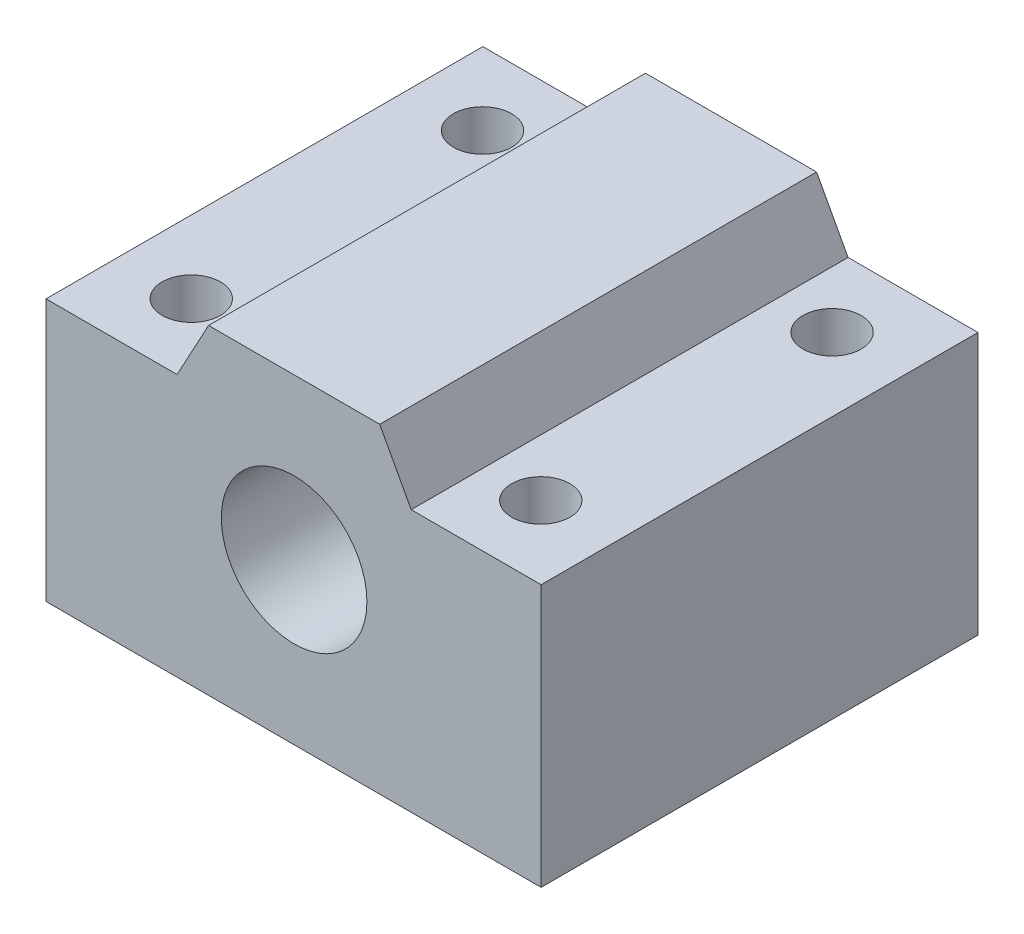
ISO-10303-21;
HEADER;
FILE_DESCRIPTION(('STEP AP214'),'2;1');
FILE_NAME('part.step','',(''),(''),'','','');
FILE_SCHEMA(('AUTOMOTIVE_DESIGN { 1 0 10303 214 1 1 1 1 }'));
ENDSEC;
DATA;
#1=APPLICATION_CONTEXT('core data for automotive mechanical design processes');
#2=APPLICATION_PROTOCOL_DEFINITION('international standard','automotive_design',2000,#1);
#3=PRODUCT_CONTEXT('',#1,'mechanical');
#4=PRODUCT('Part','Part','',(#3));
#5=PRODUCT_RELATED_PRODUCT_CATEGORY('part','',(#4));
#6=PRODUCT_DEFINITION_FORMATION('','',#4);
#7=PRODUCT_DEFINITION_CONTEXT('part definition',#1,'design');
#8=PRODUCT_DEFINITION('design','',#6,#7);
#9=PRODUCT_DEFINITION_SHAPE('','',#8);
#10=(LENGTH_UNIT() NAMED_UNIT(*) SI_UNIT(.MILLI.,.METRE.));
#11=(NAMED_UNIT(*) PLANE_ANGLE_UNIT() SI_UNIT($,.RADIAN.));
#12=(NAMED_UNIT(*) SI_UNIT($,.STERADIAN.) SOLID_ANGLE_UNIT());
#13=UNCERTAINTY_MEASURE_WITH_UNIT(LENGTH_MEASURE(1.E-05),#10,'distance_accuracy_value','');
#14=(GEOMETRIC_REPRESENTATION_CONTEXT(3) GLOBAL_UNCERTAINTY_ASSIGNED_CONTEXT((#13)) GLOBAL_UNIT_ASSIGNED_CONTEXT((#10,
#11,#12)) REPRESENTATION_CONTEXT('',''));
#15=CARTESIAN_POINT('',(0.,0.,0.));
#16=DIRECTION('',(0.,0.,1.));
#17=DIRECTION('',(1.,0.,0.));
#18=AXIS2_PLACEMENT_3D('',#15,#16,#17);
#19=CARTESIAN_POINT('',(-17.038514805397,7.00050951673756,-30.));
#20=DIRECTION('',(-1.,0.,0.));
#21=DIRECTION('',(0.,0.,1.));
#22=AXIS2_PLACEMENT_3D('',#19,#20,#21);
#23=PLANE('',#22);
#24=DIRECTION('',(0.,-1.,0.));
#25=VECTOR('',#24,1.);
#26=CARTESIAN_POINT('',(-17.038514805397,7.00050951673756,0.));
#27=LINE('',#26,#25);
#28=CARTESIAN_POINT('',(-17.038514805397,7.00050951673756,0.));
#29=VERTEX_POINT('',#28);
#30=CARTESIAN_POINT('',(-17.038514805397,-10.9994470782104,0.));
#31=VERTEX_POINT('',#30);
#32=EDGE_CURVE('E142',#29,#31,#27,.T.);
#33=ORIENTED_EDGE('',*,*,#32,.F.);
#34=DIRECTION('',(0.,0.,1.));
#35=VECTOR('',#34,1.);
#36=CARTESIAN_POINT('',(-17.038514805397,7.00050951673756,-30.));
#37=LINE('',#36,#35);
#38=CARTESIAN_POINT('',(-17.038514805397,7.00050951673756,-30.));
#39=VERTEX_POINT('',#38);
#40=EDGE_CURVE('E13',#39,#29,#37,.T.);
#41=ORIENTED_EDGE('',*,*,#40,.F.);
#42=DIRECTION('',(0.,-1.,0.));
#43=VECTOR('',#42,1.);
#44=CARTESIAN_POINT('',(-17.038514805397,7.00050951673756,-30.));
#45=LINE('',#44,#43);
#46=CARTESIAN_POINT('',(-17.038514805397,-10.9994470782104,-30.));
#47=VERTEX_POINT('',#46);
#48=EDGE_CURVE('E163',#39,#47,#45,.T.);
#49=ORIENTED_EDGE('',*,*,#48,.T.);
#50=DIRECTION('',(0.,0.,1.));
#51=VECTOR('',#50,1.);
#52=CARTESIAN_POINT('',(-17.038514805397,-10.9994470782104,-30.));
#53=LINE('',#52,#51);
#54=EDGE_CURVE('E100',#47,#31,#53,.T.);
#55=ORIENTED_EDGE('',*,*,#54,.T.);
#56=EDGE_LOOP('',(#33,#41,#49,#55));
#57=FACE_BOUND('',#56,.T.);
#58=ADVANCED_FACE('F44',(#57),#23,.T.);
#59=CARTESIAN_POINT('',(-17.038514805397,7.00050951673756,-30.));
#60=DIRECTION('',(0.,1.,0.));
#61=DIRECTION('',(0.,0.,1.));
#62=AXIS2_PLACEMENT_3D('',#59,#60,#61);
#63=PLANE('',#62);
#64=CARTESIAN_POINT('',(-12.0619027918226,7.00050951673755,-24.9999863250474));
#65=DIRECTION('',(0.,1.,0.));
#66=DIRECTION('',(0.,0.,1.));
#67=AXIS2_PLACEMENT_3D('',#64,#65,#66);
#68=CIRCLE('',#67,2.);
#69=CARTESIAN_POINT('',(-12.0619027918226,7.00050951673755,-22.9999863250474));
#70=VERTEX_POINT('',#69);
#71=EDGE_CURVE('E178',#70,#70,#68,.T.);
#72=ORIENTED_EDGE('',*,*,#71,.F.);
#73=EDGE_LOOP('',(#72));
#74=FACE_BOUND('',#73,.T.);
#75=CARTESIAN_POINT('',(-12.0619027918226,7.00050951673755,-5.));
#76=DIRECTION('',(0.,1.,0.));
#77=DIRECTION('',(0.,0.,1.));
#78=AXIS2_PLACEMENT_3D('',#75,#76,#77);
#79=CIRCLE('',#78,2.);
#80=CARTESIAN_POINT('',(-12.0619027918226,7.00050951673755,-3.));
#81=VERTEX_POINT('',#80);
#82=EDGE_CURVE('E177',#81,#81,#79,.T.);
#83=ORIENTED_EDGE('',*,*,#82,.F.);
#84=EDGE_LOOP('',(#83));
#85=FACE_BOUND('',#84,.T.);
#86=DIRECTION('',(-1.,0.,0.));
#87=VECTOR('',#86,1.);
#88=CARTESIAN_POINT('',(-17.038514805397,7.00050951673756,0.));
#89=LINE('',#88,#87);
#90=CARTESIAN_POINT('',(-8.03851480550169,7.00050951673756,0.));
#91=VERTEX_POINT('',#90);
#92=EDGE_CURVE('E161',#91,#29,#89,.T.);
#93=ORIENTED_EDGE('',*,*,#92,.F.);
#94=DIRECTION('',(0.,0.,1.));
#95=VECTOR('',#94,1.);
#96=CARTESIAN_POINT('',(-8.03851480550169,7.00050951673756,-30.));
#97=LINE('',#96,#95);
#98=CARTESIAN_POINT('',(-8.03851480550169,7.00050951673756,-30.));
#99=VERTEX_POINT('',#98);
#100=EDGE_CURVE('E53',#99,#91,#97,.T.);
#101=ORIENTED_EDGE('',*,*,#100,.F.);
#102=DIRECTION('',(-1.,0.,0.));
#103=VECTOR('',#102,1.);
#104=CARTESIAN_POINT('',(-17.038514805397,7.00050951673756,-30.));
#105=LINE('',#104,#103);
#106=EDGE_CURVE('E132',#99,#39,#105,.T.);
#107=ORIENTED_EDGE('',*,*,#106,.T.);
#108=ORIENTED_EDGE('',*,*,#40,.T.);
#109=EDGE_LOOP('',(#93,#101,#107,#108));
#110=FACE_BOUND('',#109,.T.);
#111=ADVANCED_FACE('F222',(#74,#85,#110),#63,.T.);
#112=CARTESIAN_POINT('',(-8.03851480550169,7.00050951673756,-30.));
#113=DIRECTION('',(-0.879636229350889,0.475647037217042,0.));
#114=DIRECTION('',(-0.475647037217042,-0.879636229350889,0.));
#115=AXIS2_PLACEMENT_3D('',#112,#113,#114);
#116=PLANE('',#115);
#117=DIRECTION('',(-0.475647037217042,-0.879636229350889,0.));
#118=VECTOR('',#117,1.);
#119=CARTESIAN_POINT('',(-8.03851480550169,7.00050951673756,0.));
#120=LINE('',#119,#118);
#121=CARTESIAN_POINT('',(-5.87556524650438,11.0005529217896,0.));
#122=VERTEX_POINT('',#121);
#123=EDGE_CURVE('E119',#122,#91,#120,.T.);
#124=ORIENTED_EDGE('',*,*,#123,.F.);
#125=DIRECTION('',(0.,0.,1.));
#126=VECTOR('',#125,1.);
#127=CARTESIAN_POINT('',(-5.87556524650438,11.0005529217896,-30.));
#128=LINE('',#127,#126);
#129=CARTESIAN_POINT('',(-5.87556524650438,11.0005529217896,-30.));
#130=VERTEX_POINT('',#129);
#131=EDGE_CURVE('E114',#130,#122,#128,.T.);
#132=ORIENTED_EDGE('',*,*,#131,.F.);
#133=DIRECTION('',(-0.475647037217042,-0.879636229350889,0.));
#134=VECTOR('',#133,1.);
#135=CARTESIAN_POINT('',(-8.03851480550169,7.00050951673756,-30.));
#136=LINE('',#135,#134);
#137=EDGE_CURVE('E117',#130,#99,#136,.T.);
#138=ORIENTED_EDGE('',*,*,#137,.T.);
#139=ORIENTED_EDGE('',*,*,#100,.T.);
#140=EDGE_LOOP('',(#124,#132,#138,#139));
#141=FACE_BOUND('',#140,.T.);
#142=ADVANCED_FACE('F116',(#141),#116,.T.);
#143=CARTESIAN_POINT('',(-5.87556524650438,11.0005529217896,-30.));
#144=DIRECTION('',(0.,1.,0.));
#145=DIRECTION('',(0.,0.,1.));
#146=AXIS2_PLACEMENT_3D('',#143,#144,#145);
#147=PLANE('',#146);
#148=DIRECTION('',(-1.,0.,0.));
#149=VECTOR('',#148,1.);
#150=CARTESIAN_POINT('',(-5.87556524650438,11.0005529217896,0.));
#151=LINE('',#150,#149);
#152=CARTESIAN_POINT('',(5.87759460077598,11.0005529217896,0.));
#153=VERTEX_POINT('',#152);
#154=EDGE_CURVE('E158',#153,#122,#151,.T.);
#155=ORIENTED_EDGE('',*,*,#154,.F.);
#156=DIRECTION('',(0.,0.,1.));
#157=VECTOR('',#156,1.);
#158=CARTESIAN_POINT('',(5.87759460077598,11.0005529217896,-30.));
#159=LINE('',#158,#157);
#160=CARTESIAN_POINT('',(5.87759460077598,11.0005529217896,-30.));
#161=VERTEX_POINT('',#160);
#162=EDGE_CURVE('E124',#161,#153,#159,.T.);
#163=ORIENTED_EDGE('',*,*,#162,.F.);
#164=DIRECTION('',(-1.,0.,0.));
#165=VECTOR('',#164,1.);
#166=CARTESIAN_POINT('',(-5.87556524650438,11.0005529217896,-30.));
#167=LINE('',#166,#165);
#168=EDGE_CURVE('E130',#161,#130,#167,.T.);
#169=ORIENTED_EDGE('',*,*,#168,.T.);
#170=ORIENTED_EDGE('',*,*,#131,.T.);
#171=EDGE_LOOP('',(#155,#163,#169,#170));
#172=FACE_BOUND('',#171,.T.);
#173=ADVANCED_FACE('F134',(#172),#147,.T.);
#174=CARTESIAN_POINT('',(5.87759460077598,11.0005529217896,-30.));
#175=DIRECTION('',(0.879636229350889,0.475647037217042,0.));
#176=DIRECTION('',(-0.475647037217042,0.879636229350889,0.));
#177=AXIS2_PLACEMENT_3D('',#174,#175,#176);
#178=PLANE('',#177);
#179=DIRECTION('',(-0.475647037217042,0.879636229350889,0.));
#180=VECTOR('',#179,1.);
#181=CARTESIAN_POINT('',(5.87759460077598,11.0005529217896,0.));
#182=LINE('',#181,#180);
#183=CARTESIAN_POINT('',(8.0405441597733,7.00050951673756,0.));
#184=VERTEX_POINT('',#183);
#185=EDGE_CURVE('E155',#184,#153,#182,.T.);
#186=ORIENTED_EDGE('',*,*,#185,.F.);
#187=DIRECTION('',(0.,0.,1.));
#188=VECTOR('',#187,1.);
#189=CARTESIAN_POINT('',(8.0405441597733,7.00050951673756,-30.));
#190=LINE('',#189,#188);
#191=CARTESIAN_POINT('',(8.0405441597733,7.00050951673756,-30.));
#192=VERTEX_POINT('',#191);
#193=EDGE_CURVE('E167',#192,#184,#190,.T.);
#194=ORIENTED_EDGE('',*,*,#193,.F.);
#195=DIRECTION('',(-0.475647037217042,0.879636229350889,0.));
#196=VECTOR('',#195,1.);
#197=CARTESIAN_POINT('',(5.87759460077598,11.0005529217896,-30.));
#198=LINE('',#197,#196);
#199=EDGE_CURVE('E135',#192,#161,#198,.T.);
#200=ORIENTED_EDGE('',*,*,#199,.T.);
#201=ORIENTED_EDGE('',*,*,#162,.T.);
#202=EDGE_LOOP('',(#186,#194,#200,#201));
#203=FACE_BOUND('',#202,.T.);
#204=ADVANCED_FACE('F238',(#203),#178,.T.);
#205=CARTESIAN_POINT('',(8.0405441597733,7.00050951673756,-30.));
#206=DIRECTION('',(0.,1.,0.));
#207=DIRECTION('',(0.,0.,1.));
#208=AXIS2_PLACEMENT_3D('',#205,#206,#207);
#209=PLANE('',#208);
#210=CARTESIAN_POINT('',(11.9380972081735,7.00050951673755,-5.));
#211=DIRECTION('',(0.,1.,0.));
#212=DIRECTION('',(0.,0.,1.));
#213=AXIS2_PLACEMENT_3D('',#210,#211,#212);
#214=CIRCLE('',#213,2.);
#215=CARTESIAN_POINT('',(11.9380972081735,7.00050951673755,-3.));
#216=VERTEX_POINT('',#215);
#217=EDGE_CURVE('E184',#216,#216,#214,.T.);
#218=ORIENTED_EDGE('',*,*,#217,.F.);
#219=EDGE_LOOP('',(#218));
#220=FACE_BOUND('',#219,.T.);
#221=CARTESIAN_POINT('',(11.9380972081735,7.00050951673755,-24.9999863250474));
#222=DIRECTION('',(0.,1.,0.));
#223=DIRECTION('',(0.,0.,1.));
#224=AXIS2_PLACEMENT_3D('',#221,#222,#223);
#225=CIRCLE('',#224,2.);
#226=CARTESIAN_POINT('',(11.9380972081735,7.00050951673755,-22.9999863250474));
#227=VERTEX_POINT('',#226);
#228=EDGE_CURVE('E181',#227,#227,#225,.T.);
#229=ORIENTED_EDGE('',*,*,#228,.F.);
#230=EDGE_LOOP('',(#229));
#231=FACE_BOUND('',#230,.T.);
#232=DIRECTION('',(-1.,0.,0.));
#233=VECTOR('',#232,1.);
#234=CARTESIAN_POINT('',(8.0405441597733,7.00050951673756,0.));
#235=LINE('',#234,#233);
#236=CARTESIAN_POINT('',(16.961485194603,7.00050951673756,0.));
#237=VERTEX_POINT('',#236);
#238=EDGE_CURVE('E152',#237,#184,#235,.T.);
#239=ORIENTED_EDGE('',*,*,#238,.F.);
#240=DIRECTION('',(0.,0.,1.));
#241=VECTOR('',#240,1.);
#242=CARTESIAN_POINT('',(16.961485194603,7.00050951673756,-30.));
#243=LINE('',#242,#241);
#244=CARTESIAN_POINT('',(16.961485194603,7.00050951673756,-30.));
#245=VERTEX_POINT('',#244);
#246=EDGE_CURVE('E169',#245,#237,#243,.T.);
#247=ORIENTED_EDGE('',*,*,#246,.F.);
#248=DIRECTION('',(-1.,0.,0.));
#249=VECTOR('',#248,1.);
#250=CARTESIAN_POINT('',(8.0405441597733,7.00050951673756,-30.));
#251=LINE('',#250,#249);
#252=EDGE_CURVE('E137',#245,#192,#251,.T.);
#253=ORIENTED_EDGE('',*,*,#252,.T.);
#254=ORIENTED_EDGE('',*,*,#193,.T.);
#255=EDGE_LOOP('',(#239,#247,#253,#254));
#256=FACE_BOUND('',#255,.T.);
#257=ADVANCED_FACE('F213',(#220,#231,#256),#209,.T.);
#258=CARTESIAN_POINT('',(16.961485194603,7.00050951673756,-30.));
#259=DIRECTION('',(1.,0.,0.));
#260=DIRECTION('',(0.,0.,-1.));
#261=AXIS2_PLACEMENT_3D('',#258,#259,#260);
#262=PLANE('',#261);
#263=DIRECTION('',(0.,1.,0.));
#264=VECTOR('',#263,1.);
#265=CARTESIAN_POINT('',(16.961485194603,7.00050951673756,0.));
#266=LINE('',#265,#264);
#267=CARTESIAN_POINT('',(16.961485194603,-10.9994470782104,0.));
#268=VERTEX_POINT('',#267);
#269=EDGE_CURVE('E149',#268,#237,#266,.T.);
#270=ORIENTED_EDGE('',*,*,#269,.F.);
#271=DIRECTION('',(0.,0.,1.));
#272=VECTOR('',#271,1.);
#273=CARTESIAN_POINT('',(16.961485194603,-10.9994470782104,-30.));
#274=LINE('',#273,#272);
#275=CARTESIAN_POINT('',(16.961485194603,-10.9994470782104,-30.));
#276=VERTEX_POINT('',#275);
#277=EDGE_CURVE('E171',#276,#268,#274,.T.);
#278=ORIENTED_EDGE('',*,*,#277,.F.);
#279=DIRECTION('',(0.,1.,0.));
#280=VECTOR('',#279,1.);
#281=CARTESIAN_POINT('',(16.961485194603,7.00050951673756,-30.));
#282=LINE('',#281,#280);
#283=EDGE_CURVE('E207',#276,#245,#282,.T.);
#284=ORIENTED_EDGE('',*,*,#283,.T.);
#285=ORIENTED_EDGE('',*,*,#246,.T.);
#286=EDGE_LOOP('',(#270,#278,#284,#285));
#287=FACE_BOUND('',#286,.T.);
#288=ADVANCED_FACE('F218',(#287),#262,.T.);
#289=CARTESIAN_POINT('',(-17.038514805397,-10.9994470782104,-30.));
#290=DIRECTION('',(0.,-1.,0.));
#291=DIRECTION('',(0.,0.,-1.));
#292=AXIS2_PLACEMENT_3D('',#289,#290,#291);
#293=PLANE('',#292);
#294=CARTESIAN_POINT('',(11.9380972081735,-10.9994470782104,-5.));
#295=DIRECTION('',(0.,-1.,0.));
#296=DIRECTION('',(0.,0.,-1.));
#297=AXIS2_PLACEMENT_3D('',#294,#295,#296);
#298=CIRCLE('',#297,2.);
#299=CARTESIAN_POINT('',(11.9380972081735,-10.9994470782104,-7.));
#300=VERTEX_POINT('',#299);
#301=EDGE_CURVE('E47',#300,#300,#298,.T.);
#302=ORIENTED_EDGE('',*,*,#301,.F.);
#303=EDGE_LOOP('',(#302));
#304=FACE_BOUND('',#303,.T.);
#305=CARTESIAN_POINT('',(11.9380972081735,-10.9994470782104,-24.9999863250474));
#306=DIRECTION('',(0.,-1.,0.));
#307=DIRECTION('',(0.,0.,-1.));
#308=AXIS2_PLACEMENT_3D('',#305,#306,#307);
#309=CIRCLE('',#308,2.);
#310=CARTESIAN_POINT('',(11.9380972081735,-10.9994470782104,-26.9999863250474));
#311=VERTEX_POINT('',#310);
#312=EDGE_CURVE('E182',#311,#311,#309,.T.);
#313=ORIENTED_EDGE('',*,*,#312,.F.);
#314=EDGE_LOOP('',(#313));
#315=FACE_BOUND('',#314,.T.);
#316=CARTESIAN_POINT('',(-12.0619027918226,-10.9994470782104,-24.9999863250474));
#317=DIRECTION('',(0.,-1.,0.));
#318=DIRECTION('',(0.,0.,-1.));
#319=AXIS2_PLACEMENT_3D('',#316,#317,#318);
#320=CIRCLE('',#319,2.);
#321=CARTESIAN_POINT('',(-12.0619027918226,-10.9994470782104,-26.9999863250474));
#322=VERTEX_POINT('',#321);
#323=EDGE_CURVE('E179',#322,#322,#320,.T.);
#324=ORIENTED_EDGE('',*,*,#323,.F.);
#325=EDGE_LOOP('',(#324));
#326=FACE_BOUND('',#325,.T.);
#327=CARTESIAN_POINT('',(-12.0619027918226,-10.9994470782104,-5.));
#328=DIRECTION('',(0.,-1.,0.));
#329=DIRECTION('',(0.,0.,-1.));
#330=AXIS2_PLACEMENT_3D('',#327,#328,#329);
#331=CIRCLE('',#330,2.);
#332=CARTESIAN_POINT('',(-12.0619027918226,-10.9994470782104,-7.));
#333=VERTEX_POINT('',#332);
#334=EDGE_CURVE('E174',#333,#333,#331,.T.);
#335=ORIENTED_EDGE('',*,*,#334,.F.);
#336=EDGE_LOOP('',(#335));
#337=FACE_BOUND('',#336,.T.);
#338=DIRECTION('',(1.,0.,0.));
#339=VECTOR('',#338,1.);
#340=CARTESIAN_POINT('',(-17.038514805397,-10.9994470782104,0.));
#341=LINE('',#340,#339);
#342=EDGE_CURVE('E145',#31,#268,#341,.T.);
#343=ORIENTED_EDGE('',*,*,#342,.F.);
#344=ORIENTED_EDGE('',*,*,#54,.F.);
#345=DIRECTION('',(1.,0.,0.));
#346=VECTOR('',#345,1.);
#347=CARTESIAN_POINT('',(-17.038514805397,-10.9994470782104,-30.));
#348=LINE('',#347,#346);
#349=EDGE_CURVE('E205',#47,#276,#348,.T.);
#350=ORIENTED_EDGE('',*,*,#349,.T.);
#351=ORIENTED_EDGE('',*,*,#277,.T.);
#352=EDGE_LOOP('',(#343,#344,#350,#351));
#353=FACE_BOUND('',#352,.T.);
#354=ADVANCED_FACE('F219',(#304,#315,#326,#337,#353),#293,.T.);
#355=CARTESIAN_POINT('',(0.,0.,-30.));
#356=DIRECTION('',(0.,0.,1.));
#357=DIRECTION('',(1.,0.,0.));
#358=AXIS2_PLACEMENT_3D('',#355,#356,#357);
#359=PLANE('',#358);
#360=CARTESIAN_POINT('',(0.,0.,-30.));
#361=DIRECTION('',(0.,0.,1.));
#362=DIRECTION('',(1.,0.,0.));
#363=AXIS2_PLACEMENT_3D('',#360,#361,#362);
#364=CIRCLE('',#363,5.);
#365=CARTESIAN_POINT('',(5.,0.,-30.));
#366=VERTEX_POINT('',#365);
#367=EDGE_CURVE('E146',#366,#366,#364,.T.);
#368=ORIENTED_EDGE('',*,*,#367,.T.);
#369=EDGE_LOOP('',(#368));
#370=FACE_BOUND('',#369,.T.);
#371=ORIENTED_EDGE('',*,*,#48,.F.);
#372=ORIENTED_EDGE('',*,*,#106,.F.);
#373=ORIENTED_EDGE('',*,*,#137,.F.);
#374=ORIENTED_EDGE('',*,*,#168,.F.);
#375=ORIENTED_EDGE('',*,*,#199,.F.);
#376=ORIENTED_EDGE('',*,*,#252,.F.);
#377=ORIENTED_EDGE('',*,*,#283,.F.);
#378=ORIENTED_EDGE('',*,*,#349,.F.);
#379=EDGE_LOOP('',(#371,#372,#373,#374,#375,#376,#377,#378));
#380=FACE_BOUND('',#379,.T.);
#381=ADVANCED_FACE('F128',(#370,#380),#359,.F.);
#382=CARTESIAN_POINT('',(0.,0.,0.));
#383=DIRECTION('',(0.,0.,1.));
#384=DIRECTION('',(1.,0.,0.));
#385=AXIS2_PLACEMENT_3D('',#382,#383,#384);
#386=PLANE('',#385);
#387=CARTESIAN_POINT('',(0.,0.,0.));
#388=DIRECTION('',(0.,0.,1.));
#389=DIRECTION('',(1.,0.,0.));
#390=AXIS2_PLACEMENT_3D('',#387,#388,#389);
#391=CIRCLE('',#390,5.);
#392=CARTESIAN_POINT('',(5.,0.,0.));
#393=VERTEX_POINT('',#392);
#394=EDGE_CURVE('E199',#393,#393,#391,.T.);
#395=ORIENTED_EDGE('',*,*,#394,.F.);
#396=EDGE_LOOP('',(#395));
#397=FACE_BOUND('',#396,.T.);
#398=ORIENTED_EDGE('',*,*,#32,.T.);
#399=ORIENTED_EDGE('',*,*,#342,.T.);
#400=ORIENTED_EDGE('',*,*,#269,.T.);
#401=ORIENTED_EDGE('',*,*,#238,.T.);
#402=ORIENTED_EDGE('',*,*,#185,.T.);
#403=ORIENTED_EDGE('',*,*,#154,.T.);
#404=ORIENTED_EDGE('',*,*,#123,.T.);
#405=ORIENTED_EDGE('',*,*,#92,.T.);
#406=EDGE_LOOP('',(#398,#399,#400,#401,#402,#403,#404,#405));
#407=FACE_BOUND('',#406,.T.);
#408=ADVANCED_FACE('F221',(#397,#407),#386,.T.);
#409=CARTESIAN_POINT('',(0.,0.,-30.));
#410=DIRECTION('',(0.,0.,1.));
#411=DIRECTION('',(1.,0.,0.));
#412=AXIS2_PLACEMENT_3D('',#409,#410,#411);
#413=CYLINDRICAL_SURFACE('',#412,5.);
#414=ORIENTED_EDGE('',*,*,#367,.F.);
#415=EDGE_LOOP('',(#414));
#416=FACE_BOUND('',#415,.T.);
#417=ORIENTED_EDGE('',*,*,#394,.T.);
#418=EDGE_LOOP('',(#417));
#419=FACE_BOUND('',#418,.T.);
#420=ADVANCED_FACE('F262',(#416,#419),#413,.F.);
#421=CARTESIAN_POINT('',(-12.0619027918226,-12.5,-5.));
#422=DIRECTION('',(0.,1.,0.));
#423=DIRECTION('',(0.,0.,1.));
#424=AXIS2_PLACEMENT_3D('',#421,#422,#423);
#425=CYLINDRICAL_SURFACE('',#424,2.);
#426=ORIENTED_EDGE('',*,*,#82,.T.);
#427=EDGE_LOOP('',(#426));
#428=FACE_BOUND('',#427,.T.);
#429=ORIENTED_EDGE('',*,*,#334,.T.);
#430=EDGE_LOOP('',(#429));
#431=FACE_BOUND('',#430,.T.);
#432=ADVANCED_FACE('F259',(#428,#431),#425,.F.);
#433=CARTESIAN_POINT('',(-12.0619027918226,-12.5,-24.9999863250474));
#434=DIRECTION('',(0.,1.,0.));
#435=DIRECTION('',(0.,0.,1.));
#436=AXIS2_PLACEMENT_3D('',#433,#434,#435);
#437=CYLINDRICAL_SURFACE('',#436,2.);
#438=ORIENTED_EDGE('',*,*,#71,.T.);
#439=EDGE_LOOP('',(#438));
#440=FACE_BOUND('',#439,.T.);
#441=ORIENTED_EDGE('',*,*,#323,.T.);
#442=EDGE_LOOP('',(#441));
#443=FACE_BOUND('',#442,.T.);
#444=ADVANCED_FACE('F261',(#440,#443),#437,.F.);
#445=CARTESIAN_POINT('',(11.9380972081735,-12.5,-24.9999863250474));
#446=DIRECTION('',(0.,1.,0.));
#447=DIRECTION('',(0.,0.,1.));
#448=AXIS2_PLACEMENT_3D('',#445,#446,#447);
#449=CYLINDRICAL_SURFACE('',#448,2.);
#450=ORIENTED_EDGE('',*,*,#228,.T.);
#451=EDGE_LOOP('',(#450));
#452=FACE_BOUND('',#451,.T.);
#453=ORIENTED_EDGE('',*,*,#312,.T.);
#454=EDGE_LOOP('',(#453));
#455=FACE_BOUND('',#454,.T.);
#456=ADVANCED_FACE('F269',(#452,#455),#449,.F.);
#457=CARTESIAN_POINT('',(11.9380972081735,-12.5,-5.));
#458=DIRECTION('',(0.,1.,0.));
#459=DIRECTION('',(0.,0.,1.));
#460=AXIS2_PLACEMENT_3D('',#457,#458,#459);
#461=CYLINDRICAL_SURFACE('',#460,2.);
#462=ORIENTED_EDGE('',*,*,#217,.T.);
#463=EDGE_LOOP('',(#462));
#464=FACE_BOUND('',#463,.T.);
#465=ORIENTED_EDGE('',*,*,#301,.T.);
#466=EDGE_LOOP('',(#465));
#467=FACE_BOUND('',#466,.T.);
#468=ADVANCED_FACE('F277',(#464,#467),#461,.F.);
#469=CLOSED_SHELL('',(#58,#111,#142,#173,#204,#257,#288,#354,#381,#408,#420,#432,#444,#456,#468));
#470=MANIFOLD_SOLID_BREP('B2',#469);
#471=ADVANCED_BREP_SHAPE_REPRESENTATION('',(#18,#470),#14);
#472=SHAPE_DEFINITION_REPRESENTATION(#9,#471);
ENDSEC;
END-ISO-10303-21;
